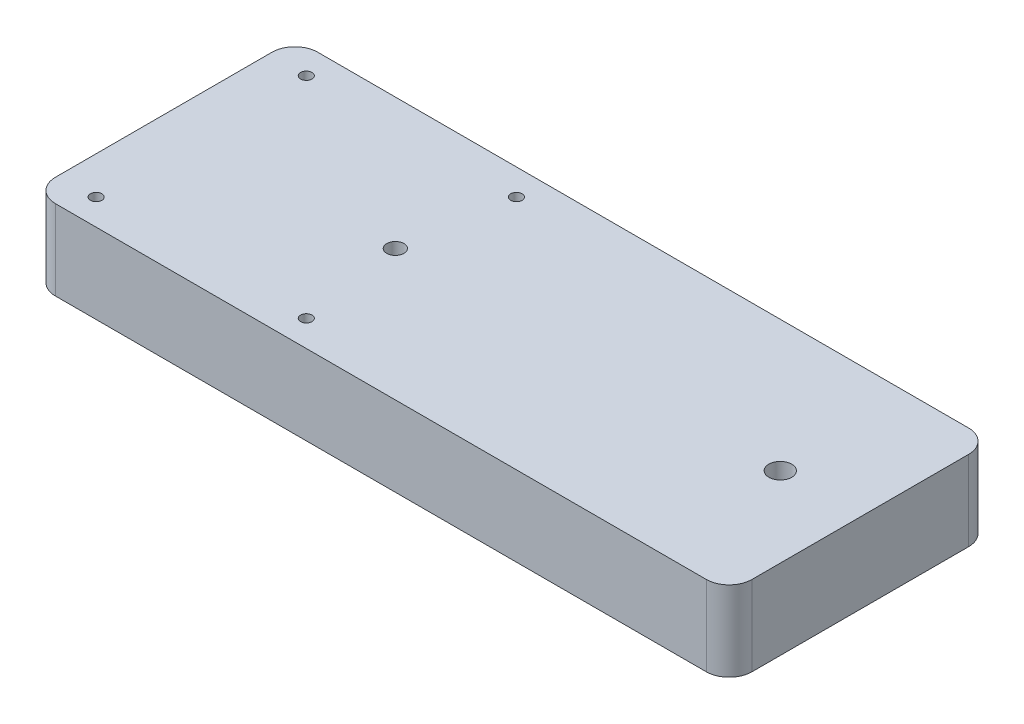
ISO-10303-21;
HEADER;
FILE_DESCRIPTION(('STEP AP214'),'2;1');
FILE_NAME('part.step','',(''),(''),'','','');
FILE_SCHEMA(('AUTOMOTIVE_DESIGN { 1 0 10303 214 1 1 1 1 }'));
ENDSEC;
DATA;
#1=APPLICATION_CONTEXT('core data for automotive mechanical design processes');
#2=APPLICATION_PROTOCOL_DEFINITION('international standard','automotive_design',2000,#1);
#3=PRODUCT_CONTEXT('',#1,'mechanical');
#4=PRODUCT('Part','Part','',(#3));
#5=PRODUCT_RELATED_PRODUCT_CATEGORY('part','',(#4));
#6=PRODUCT_DEFINITION_FORMATION('','',#4);
#7=PRODUCT_DEFINITION_CONTEXT('part definition',#1,'design');
#8=PRODUCT_DEFINITION('design','',#6,#7);
#9=PRODUCT_DEFINITION_SHAPE('','',#8);
#10=(LENGTH_UNIT() NAMED_UNIT(*) SI_UNIT(.MILLI.,.METRE.));
#11=(NAMED_UNIT(*) PLANE_ANGLE_UNIT() SI_UNIT($,.RADIAN.));
#12=(NAMED_UNIT(*) SI_UNIT($,.STERADIAN.) SOLID_ANGLE_UNIT());
#13=UNCERTAINTY_MEASURE_WITH_UNIT(LENGTH_MEASURE(1.E-05),#10,'distance_accuracy_value','');
#14=(GEOMETRIC_REPRESENTATION_CONTEXT(3) GLOBAL_UNCERTAINTY_ASSIGNED_CONTEXT((#13)) GLOBAL_UNIT_ASSIGNED_CONTEXT((#10,
#11,#12)) REPRESENTATION_CONTEXT('',''));
#15=CARTESIAN_POINT('',(0.,0.,0.));
#16=DIRECTION('',(0.,0.,1.));
#17=DIRECTION('',(1.,0.,0.));
#18=AXIS2_PLACEMENT_3D('',#15,#16,#17);
#19=CARTESIAN_POINT('',(232.381351684201,35.,47.3813516842006));
#20=DIRECTION('',(0.,-1.,0.));
#21=DIRECTION('',(0.,0.,-1.));
#22=AXIS2_PLACEMENT_3D('',#19,#20,#21);
#23=CYLINDRICAL_SURFACE('',#22,10.);
#24=CARTESIAN_POINT('',(232.381351684201,0.,47.3813516842006));
#25=DIRECTION('',(0.,1.,0.));
#26=DIRECTION('',(0.,0.,1.));
#27=AXIS2_PLACEMENT_3D('',#24,#25,#26);
#28=CIRCLE('',#27,10.);
#29=CARTESIAN_POINT('',(232.381351684201,0.,57.3813516842006));
#30=VERTEX_POINT('',#29);
#31=CARTESIAN_POINT('',(242.381351684201,0.,47.3813516842006));
#32=VERTEX_POINT('',#31);
#33=EDGE_CURVE('E134',#30,#32,#28,.T.);
#34=ORIENTED_EDGE('',*,*,#33,.T.);
#35=DIRECTION('',(0.,-1.,0.));
#36=VECTOR('',#35,1.);
#37=CARTESIAN_POINT('',(242.381351684201,35.,47.3813516842006));
#38=LINE('',#37,#36);
#39=CARTESIAN_POINT('',(242.381351684201,35.,47.3813516842006));
#40=VERTEX_POINT('',#39);
#41=EDGE_CURVE('E42',#40,#32,#38,.T.);
#42=ORIENTED_EDGE('',*,*,#41,.F.);
#43=CARTESIAN_POINT('',(232.381351684201,35.,47.3813516842006));
#44=DIRECTION('',(0.,1.,0.));
#45=DIRECTION('',(0.,0.,1.));
#46=AXIS2_PLACEMENT_3D('',#43,#44,#45);
#47=CIRCLE('',#46,10.);
#48=CARTESIAN_POINT('',(232.381351684201,35.,57.3813516842006));
#49=VERTEX_POINT('',#48);
#50=EDGE_CURVE('E94',#49,#40,#47,.T.);
#51=ORIENTED_EDGE('',*,*,#50,.F.);
#52=DIRECTION('',(0.,-1.,0.));
#53=VECTOR('',#52,1.);
#54=CARTESIAN_POINT('',(232.381351684201,35.,57.3813516842006));
#55=LINE('',#54,#53);
#56=EDGE_CURVE('E11',#49,#30,#55,.T.);
#57=ORIENTED_EDGE('',*,*,#56,.T.);
#58=EDGE_LOOP('',(#34,#42,#51,#57));
#59=FACE_BOUND('',#58,.T.);
#60=ADVANCED_FACE('F34',(#59),#23,.T.);
#61=CARTESIAN_POINT('',(242.381351684201,35.,-47.3813516842006));
#62=DIRECTION('',(-1.,0.,0.));
#63=DIRECTION('',(0.,0.,1.));
#64=AXIS2_PLACEMENT_3D('',#61,#62,#63);
#65=PLANE('',#64);
#66=DIRECTION('',(0.,0.,-1.));
#67=VECTOR('',#66,1.);
#68=CARTESIAN_POINT('',(242.381351684201,0.,-47.3813516842006));
#69=LINE('',#68,#67);
#70=CARTESIAN_POINT('',(242.381351684201,0.,-47.3813516842006));
#71=VERTEX_POINT('',#70);
#72=EDGE_CURVE('E136',#32,#71,#69,.T.);
#73=ORIENTED_EDGE('',*,*,#72,.T.);
#74=DIRECTION('',(0.,-1.,0.));
#75=VECTOR('',#74,1.);
#76=CARTESIAN_POINT('',(242.381351684201,35.,-47.3813516842006));
#77=LINE('',#76,#75);
#78=CARTESIAN_POINT('',(242.381351684201,35.,-47.3813516842006));
#79=VERTEX_POINT('',#78);
#80=EDGE_CURVE('E155',#79,#71,#77,.T.);
#81=ORIENTED_EDGE('',*,*,#80,.F.);
#82=DIRECTION('',(0.,0.,-1.));
#83=VECTOR('',#82,1.);
#84=CARTESIAN_POINT('',(242.381351684201,35.,-47.3813516842006));
#85=LINE('',#84,#83);
#86=EDGE_CURVE('E163',#40,#79,#85,.T.);
#87=ORIENTED_EDGE('',*,*,#86,.F.);
#88=ORIENTED_EDGE('',*,*,#41,.T.);
#89=EDGE_LOOP('',(#73,#81,#87,#88));
#90=FACE_BOUND('',#89,.T.);
#91=ADVANCED_FACE('F161',(#90),#65,.F.);
#92=CARTESIAN_POINT('',(232.381351684201,35.,-47.3813516842006));
#93=DIRECTION('',(0.,-1.,0.));
#94=DIRECTION('',(0.,0.,-1.));
#95=AXIS2_PLACEMENT_3D('',#92,#93,#94);
#96=CYLINDRICAL_SURFACE('',#95,10.);
#97=CARTESIAN_POINT('',(232.381351684201,0.,-47.3813516842006));
#98=DIRECTION('',(0.,1.,0.));
#99=DIRECTION('',(0.,0.,-1.));
#100=AXIS2_PLACEMENT_3D('',#97,#98,#99);
#101=CIRCLE('',#100,10.);
#102=CARTESIAN_POINT('',(232.381351684201,0.,-57.3813516842006));
#103=VERTEX_POINT('',#102);
#104=EDGE_CURVE('E139',#71,#103,#101,.T.);
#105=ORIENTED_EDGE('',*,*,#104,.T.);
#106=DIRECTION('',(0.,-1.,0.));
#107=VECTOR('',#106,1.);
#108=CARTESIAN_POINT('',(232.381351684201,35.,-57.3813516842006));
#109=LINE('',#108,#107);
#110=CARTESIAN_POINT('',(232.381351684201,35.,-57.3813516842006));
#111=VERTEX_POINT('',#110);
#112=EDGE_CURVE('E152',#111,#103,#109,.T.);
#113=ORIENTED_EDGE('',*,*,#112,.F.);
#114=CARTESIAN_POINT('',(232.381351684201,35.,-47.3813516842006));
#115=DIRECTION('',(0.,1.,0.));
#116=DIRECTION('',(0.,0.,-1.));
#117=AXIS2_PLACEMENT_3D('',#114,#115,#116);
#118=CIRCLE('',#117,10.);
#119=EDGE_CURVE('E175',#79,#111,#118,.T.);
#120=ORIENTED_EDGE('',*,*,#119,.F.);
#121=ORIENTED_EDGE('',*,*,#80,.T.);
#122=EDGE_LOOP('',(#105,#113,#120,#121));
#123=FACE_BOUND('',#122,.T.);
#124=ADVANCED_FACE('F171',(#123),#96,.T.);
#125=CARTESIAN_POINT('',(-52.3813516842006,35.,-57.3813516842006));
#126=DIRECTION('',(0.,0.,1.));
#127=DIRECTION('',(1.,0.,0.));
#128=AXIS2_PLACEMENT_3D('',#125,#126,#127);
#129=PLANE('',#128);
#130=DIRECTION('',(-1.,0.,0.));
#131=VECTOR('',#130,1.);
#132=CARTESIAN_POINT('',(-52.3813516842006,0.,-57.3813516842006));
#133=LINE('',#132,#131);
#134=CARTESIAN_POINT('',(-52.3813516842006,0.,-57.3813516842006));
#135=VERTEX_POINT('',#134);
#136=EDGE_CURVE('E142',#103,#135,#133,.T.);
#137=ORIENTED_EDGE('',*,*,#136,.T.);
#138=DIRECTION('',(0.,-1.,0.));
#139=VECTOR('',#138,1.);
#140=CARTESIAN_POINT('',(-52.3813516842006,35.,-57.3813516842006));
#141=LINE('',#140,#139);
#142=CARTESIAN_POINT('',(-52.3813516842006,35.,-57.3813516842006));
#143=VERTEX_POINT('',#142);
#144=EDGE_CURVE('E123',#143,#135,#141,.T.);
#145=ORIENTED_EDGE('',*,*,#144,.F.);
#146=DIRECTION('',(-1.,0.,0.));
#147=VECTOR('',#146,1.);
#148=CARTESIAN_POINT('',(62.3813516842006,35.,-57.3813516842006));
#149=LINE('',#148,#147);
#150=EDGE_CURVE('E114',#111,#143,#149,.T.);
#151=ORIENTED_EDGE('',*,*,#150,.F.);
#152=ORIENTED_EDGE('',*,*,#112,.T.);
#153=EDGE_LOOP('',(#137,#145,#151,#152));
#154=FACE_BOUND('',#153,.T.);
#155=ADVANCED_FACE('F174',(#154),#129,.F.);
#156=CARTESIAN_POINT('',(-52.3813516842006,35.,-47.3813516842006));
#157=DIRECTION('',(0.,-1.,0.));
#158=DIRECTION('',(0.,0.,-1.));
#159=AXIS2_PLACEMENT_3D('',#156,#157,#158);
#160=CYLINDRICAL_SURFACE('',#159,10.);
#161=CARTESIAN_POINT('',(-52.3813516842006,0.,-47.3813516842006));
#162=DIRECTION('',(0.,1.,0.));
#163=DIRECTION('',(0.,0.,1.));
#164=AXIS2_PLACEMENT_3D('',#161,#162,#163);
#165=CIRCLE('',#164,10.);
#166=CARTESIAN_POINT('',(-62.3813516842006,0.,-47.3813516842006));
#167=VERTEX_POINT('',#166);
#168=EDGE_CURVE('E122',#135,#167,#165,.T.);
#169=ORIENTED_EDGE('',*,*,#168,.T.);
#170=DIRECTION('',(0.,-1.,0.));
#171=VECTOR('',#170,1.);
#172=CARTESIAN_POINT('',(-62.3813516842006,35.,-47.3813516842006));
#173=LINE('',#172,#171);
#174=CARTESIAN_POINT('',(-62.3813516842006,35.,-47.3813516842006));
#175=VERTEX_POINT('',#174);
#176=EDGE_CURVE('E119',#175,#167,#173,.T.);
#177=ORIENTED_EDGE('',*,*,#176,.F.);
#178=CARTESIAN_POINT('',(-52.3813516842006,35.,-47.3813516842006));
#179=DIRECTION('',(0.,1.,0.));
#180=DIRECTION('',(0.,0.,1.));
#181=AXIS2_PLACEMENT_3D('',#178,#179,#180);
#182=CIRCLE('',#181,10.);
#183=EDGE_CURVE('E108',#143,#175,#182,.T.);
#184=ORIENTED_EDGE('',*,*,#183,.F.);
#185=ORIENTED_EDGE('',*,*,#144,.T.);
#186=EDGE_LOOP('',(#169,#177,#184,#185));
#187=FACE_BOUND('',#186,.T.);
#188=ADVANCED_FACE('F120',(#187),#160,.T.);
#189=CARTESIAN_POINT('',(-62.3813516842006,35.,-47.3813516842006));
#190=DIRECTION('',(1.,0.,0.));
#191=DIRECTION('',(0.,0.,-1.));
#192=AXIS2_PLACEMENT_3D('',#189,#190,#191);
#193=PLANE('',#192);
#194=DIRECTION('',(0.,0.,1.));
#195=VECTOR('',#194,1.);
#196=CARTESIAN_POINT('',(-62.3813516842006,0.,-47.3813516842006));
#197=LINE('',#196,#195);
#198=CARTESIAN_POINT('',(-62.3813516842006,0.,47.3813516842006));
#199=VERTEX_POINT('',#198);
#200=EDGE_CURVE('E80',#167,#199,#197,.T.);
#201=ORIENTED_EDGE('',*,*,#200,.T.);
#202=DIRECTION('',(0.,-1.,0.));
#203=VECTOR('',#202,1.);
#204=CARTESIAN_POINT('',(-62.3813516842006,35.,47.3813516842006));
#205=LINE('',#204,#203);
#206=CARTESIAN_POINT('',(-62.3813516842006,35.,47.3813516842006));
#207=VERTEX_POINT('',#206);
#208=EDGE_CURVE('E124',#207,#199,#205,.T.);
#209=ORIENTED_EDGE('',*,*,#208,.F.);
#210=DIRECTION('',(0.,0.,1.));
#211=VECTOR('',#210,1.);
#212=CARTESIAN_POINT('',(-62.3813516842006,35.,-47.3813516842006));
#213=LINE('',#212,#211);
#214=EDGE_CURVE('E112',#175,#207,#213,.T.);
#215=ORIENTED_EDGE('',*,*,#214,.F.);
#216=ORIENTED_EDGE('',*,*,#176,.T.);
#217=EDGE_LOOP('',(#201,#209,#215,#216));
#218=FACE_BOUND('',#217,.T.);
#219=ADVANCED_FACE('F126',(#218),#193,.F.);
#220=CARTESIAN_POINT('',(-52.3813516842006,35.,47.3813516842006));
#221=DIRECTION('',(0.,-1.,0.));
#222=DIRECTION('',(0.,0.,-1.));
#223=AXIS2_PLACEMENT_3D('',#220,#221,#222);
#224=CYLINDRICAL_SURFACE('',#223,9.99999999999999);
#225=CARTESIAN_POINT('',(-52.3813516842006,0.,47.3813516842006));
#226=DIRECTION('',(0.,1.,0.));
#227=DIRECTION('',(0.,0.,1.));
#228=AXIS2_PLACEMENT_3D('',#225,#226,#227);
#229=CIRCLE('',#228,9.99999999999999);
#230=CARTESIAN_POINT('',(-52.3813516842006,0.,57.3813516842006));
#231=VERTEX_POINT('',#230);
#232=EDGE_CURVE('E87',#199,#231,#229,.T.);
#233=ORIENTED_EDGE('',*,*,#232,.T.);
#234=DIRECTION('',(0.,-1.,0.));
#235=VECTOR('',#234,1.);
#236=CARTESIAN_POINT('',(-52.3813516842006,35.,57.3813516842006));
#237=LINE('',#236,#235);
#238=CARTESIAN_POINT('',(-52.3813516842006,35.,57.3813516842006));
#239=VERTEX_POINT('',#238);
#240=EDGE_CURVE('E130',#239,#231,#237,.T.);
#241=ORIENTED_EDGE('',*,*,#240,.F.);
#242=CARTESIAN_POINT('',(-52.3813516842006,35.,47.3813516842006));
#243=DIRECTION('',(0.,1.,0.));
#244=DIRECTION('',(0.,0.,1.));
#245=AXIS2_PLACEMENT_3D('',#242,#243,#244);
#246=CIRCLE('',#245,9.99999999999999);
#247=EDGE_CURVE('E128',#207,#239,#246,.T.);
#248=ORIENTED_EDGE('',*,*,#247,.F.);
#249=ORIENTED_EDGE('',*,*,#208,.T.);
#250=EDGE_LOOP('',(#233,#241,#248,#249));
#251=FACE_BOUND('',#250,.T.);
#252=ADVANCED_FACE('F252',(#251),#224,.T.);
#253=CARTESIAN_POINT('',(-52.3813516842006,35.,57.3813516842006));
#254=DIRECTION('',(0.,0.,-1.));
#255=DIRECTION('',(-1.,0.,0.));
#256=AXIS2_PLACEMENT_3D('',#253,#254,#255);
#257=PLANE('',#256);
#258=DIRECTION('',(1.,0.,0.));
#259=VECTOR('',#258,1.);
#260=CARTESIAN_POINT('',(-52.3813516842006,0.,57.3813516842006));
#261=LINE('',#260,#259);
#262=EDGE_CURVE('E147',#231,#30,#261,.T.);
#263=ORIENTED_EDGE('',*,*,#262,.T.);
#264=ORIENTED_EDGE('',*,*,#56,.F.);
#265=DIRECTION('',(1.,0.,0.));
#266=VECTOR('',#265,1.);
#267=CARTESIAN_POINT('',(62.3813516842006,35.,57.3813516842006));
#268=LINE('',#267,#266);
#269=EDGE_CURVE('E50',#239,#49,#268,.T.);
#270=ORIENTED_EDGE('',*,*,#269,.F.);
#271=ORIENTED_EDGE('',*,*,#240,.T.);
#272=EDGE_LOOP('',(#263,#264,#270,#271));
#273=FACE_BOUND('',#272,.T.);
#274=ADVANCED_FACE('F229',(#273),#257,.F.);
#275=CARTESIAN_POINT('',(232.381351684201,35.,47.3813516842006));
#276=DIRECTION('',(0.,1.,0.));
#277=DIRECTION('',(0.,0.,1.));
#278=AXIS2_PLACEMENT_3D('',#275,#276,#277);
#279=PLANE('',#278);
#280=CARTESIAN_POINT('',(-45.9619407771253,35.,-45.9619407771256));
#281=DIRECTION('',(0.,1.,0.));
#282=DIRECTION('',(0.,0.,1.));
#283=AXIS2_PLACEMENT_3D('',#280,#281,#282);
#284=CIRCLE('',#283,2.5);
#285=CARTESIAN_POINT('',(-45.9619407771253,35.,-43.4619407771256));
#286=VERTEX_POINT('',#285);
#287=EDGE_CURVE('E193',#286,#286,#284,.T.);
#288=ORIENTED_EDGE('',*,*,#287,.F.);
#289=EDGE_LOOP('',(#288));
#290=FACE_BOUND('',#289,.T.);
#291=CARTESIAN_POINT('',(-45.9619407771252,35.,45.9619407771253));
#292=DIRECTION('',(0.,1.,0.));
#293=DIRECTION('',(0.,0.,1.));
#294=AXIS2_PLACEMENT_3D('',#291,#292,#293);
#295=CIRCLE('',#294,2.5);
#296=CARTESIAN_POINT('',(-45.9619407771252,35.,48.4619407771253));
#297=VERTEX_POINT('',#296);
#298=EDGE_CURVE('E199',#297,#297,#295,.T.);
#299=ORIENTED_EDGE('',*,*,#298,.F.);
#300=EDGE_LOOP('',(#299));
#301=FACE_BOUND('',#300,.T.);
#302=CARTESIAN_POINT('',(45.9619407771256,35.,45.9619407771253));
#303=DIRECTION('',(0.,1.,0.));
#304=DIRECTION('',(0.,0.,1.));
#305=AXIS2_PLACEMENT_3D('',#302,#303,#304);
#306=CIRCLE('',#305,2.5);
#307=CARTESIAN_POINT('',(45.9619407771256,35.,48.4619407771253));
#308=VERTEX_POINT('',#307);
#309=EDGE_CURVE('E205',#308,#308,#306,.T.);
#310=ORIENTED_EDGE('',*,*,#309,.F.);
#311=EDGE_LOOP('',(#310));
#312=FACE_BOUND('',#311,.T.);
#313=CARTESIAN_POINT('',(38.9619407771256,35.,0.));
#314=DIRECTION('',(0.,1.,0.));
#315=DIRECTION('',(0.,0.,1.));
#316=AXIS2_PLACEMENT_3D('',#313,#314,#315);
#317=CIRCLE('',#316,3.75000000000001);
#318=CARTESIAN_POINT('',(38.9619407771256,35.,3.75000000000001));
#319=VERTEX_POINT('',#318);
#320=EDGE_CURVE('E211',#319,#319,#317,.T.);
#321=ORIENTED_EDGE('',*,*,#320,.F.);
#322=EDGE_LOOP('',(#321));
#323=FACE_BOUND('',#322,.T.);
#324=CARTESIAN_POINT('',(45.9619407771256,35.,-45.9619407771256));
#325=DIRECTION('',(0.,1.,0.));
#326=DIRECTION('',(0.,0.,1.));
#327=AXIS2_PLACEMENT_3D('',#324,#325,#326);
#328=CIRCLE('',#327,2.5);
#329=CARTESIAN_POINT('',(45.9619407771256,35.,-43.4619407771256));
#330=VERTEX_POINT('',#329);
#331=EDGE_CURVE('E187',#330,#330,#328,.T.);
#332=ORIENTED_EDGE('',*,*,#331,.F.);
#333=EDGE_LOOP('',(#332));
#334=FACE_BOUND('',#333,.T.);
#335=CARTESIAN_POINT('',(207.381351684201,35.,0.));
#336=DIRECTION('',(0.,1.,0.));
#337=DIRECTION('',(0.,0.,1.));
#338=AXIS2_PLACEMENT_3D('',#335,#336,#337);
#339=CIRCLE('',#338,4.99999999999999);
#340=CARTESIAN_POINT('',(207.381351684201,35.,4.99999999999999));
#341=VERTEX_POINT('',#340);
#342=EDGE_CURVE('E183',#341,#341,#339,.T.);
#343=ORIENTED_EDGE('',*,*,#342,.F.);
#344=EDGE_LOOP('',(#343));
#345=FACE_BOUND('',#344,.T.);
#346=ORIENTED_EDGE('',*,*,#269,.T.);
#347=ORIENTED_EDGE('',*,*,#50,.T.);
#348=ORIENTED_EDGE('',*,*,#86,.T.);
#349=ORIENTED_EDGE('',*,*,#119,.T.);
#350=ORIENTED_EDGE('',*,*,#150,.T.);
#351=ORIENTED_EDGE('',*,*,#183,.T.);
#352=ORIENTED_EDGE('',*,*,#214,.T.);
#353=ORIENTED_EDGE('',*,*,#247,.T.);
#354=EDGE_LOOP('',(#346,#347,#348,#349,#350,#351,#352,#353));
#355=FACE_BOUND('',#354,.T.);
#356=ADVANCED_FACE('F110',(#290,#301,#312,#323,#334,#345,#355),#279,.T.);
#357=CARTESIAN_POINT('',(232.381351684201,0.,47.3813516842006));
#358=DIRECTION('',(0.,1.,0.));
#359=DIRECTION('',(0.,0.,1.));
#360=AXIS2_PLACEMENT_3D('',#357,#358,#359);
#361=PLANE('',#360);
#362=CARTESIAN_POINT('',(-45.9619407771253,0.,-45.9619407771256));
#363=DIRECTION('',(0.,1.,0.));
#364=DIRECTION('',(0.,0.,1.));
#365=AXIS2_PLACEMENT_3D('',#362,#363,#364);
#366=CIRCLE('',#365,2.5);
#367=CARTESIAN_POINT('',(-45.9619407771253,0.,-43.4619407771256));
#368=VERTEX_POINT('',#367);
#369=EDGE_CURVE('E196',#368,#368,#366,.T.);
#370=ORIENTED_EDGE('',*,*,#369,.T.);
#371=EDGE_LOOP('',(#370));
#372=FACE_BOUND('',#371,.T.);
#373=CARTESIAN_POINT('',(-45.9619407771252,0.,45.9619407771253));
#374=DIRECTION('',(0.,1.,0.));
#375=DIRECTION('',(0.,0.,1.));
#376=AXIS2_PLACEMENT_3D('',#373,#374,#375);
#377=CIRCLE('',#376,2.5);
#378=CARTESIAN_POINT('',(-45.9619407771252,0.,48.4619407771253));
#379=VERTEX_POINT('',#378);
#380=EDGE_CURVE('E202',#379,#379,#377,.T.);
#381=ORIENTED_EDGE('',*,*,#380,.T.);
#382=EDGE_LOOP('',(#381));
#383=FACE_BOUND('',#382,.T.);
#384=CARTESIAN_POINT('',(45.9619407771256,0.,45.9619407771253));
#385=DIRECTION('',(0.,1.,0.));
#386=DIRECTION('',(0.,0.,1.));
#387=AXIS2_PLACEMENT_3D('',#384,#385,#386);
#388=CIRCLE('',#387,2.5);
#389=CARTESIAN_POINT('',(45.9619407771256,0.,48.4619407771253));
#390=VERTEX_POINT('',#389);
#391=EDGE_CURVE('E208',#390,#390,#388,.T.);
#392=ORIENTED_EDGE('',*,*,#391,.T.);
#393=EDGE_LOOP('',(#392));
#394=FACE_BOUND('',#393,.T.);
#395=CARTESIAN_POINT('',(38.9619407771256,0.,0.));
#396=DIRECTION('',(0.,1.,0.));
#397=DIRECTION('',(0.,0.,1.));
#398=AXIS2_PLACEMENT_3D('',#395,#396,#397);
#399=CIRCLE('',#398,3.75000000000001);
#400=CARTESIAN_POINT('',(38.9619407771256,0.,3.75000000000001));
#401=VERTEX_POINT('',#400);
#402=EDGE_CURVE('E190',#401,#401,#399,.T.);
#403=ORIENTED_EDGE('',*,*,#402,.T.);
#404=EDGE_LOOP('',(#403));
#405=FACE_BOUND('',#404,.T.);
#406=CARTESIAN_POINT('',(45.9619407771256,0.,-45.9619407771256));
#407=DIRECTION('',(0.,1.,0.));
#408=DIRECTION('',(0.,0.,1.));
#409=AXIS2_PLACEMENT_3D('',#406,#407,#408);
#410=CIRCLE('',#409,2.5);
#411=CARTESIAN_POINT('',(45.9619407771256,0.,-43.4619407771256));
#412=VERTEX_POINT('',#411);
#413=EDGE_CURVE('E186',#412,#412,#410,.T.);
#414=ORIENTED_EDGE('',*,*,#413,.T.);
#415=EDGE_LOOP('',(#414));
#416=FACE_BOUND('',#415,.T.);
#417=CARTESIAN_POINT('',(207.381351684201,0.,0.));
#418=DIRECTION('',(0.,1.,0.));
#419=DIRECTION('',(0.,0.,1.));
#420=AXIS2_PLACEMENT_3D('',#417,#418,#419);
#421=CIRCLE('',#420,4.99999999999999);
#422=CARTESIAN_POINT('',(207.381351684201,0.,4.99999999999999));
#423=VERTEX_POINT('',#422);
#424=EDGE_CURVE('E137',#423,#423,#421,.F.);
#425=ORIENTED_EDGE('',*,*,#424,.F.);
#426=EDGE_LOOP('',(#425));
#427=FACE_BOUND('',#426,.T.);
#428=ORIENTED_EDGE('',*,*,#33,.F.);
#429=ORIENTED_EDGE('',*,*,#262,.F.);
#430=ORIENTED_EDGE('',*,*,#232,.F.);
#431=ORIENTED_EDGE('',*,*,#200,.F.);
#432=ORIENTED_EDGE('',*,*,#168,.F.);
#433=ORIENTED_EDGE('',*,*,#136,.F.);
#434=ORIENTED_EDGE('',*,*,#104,.F.);
#435=ORIENTED_EDGE('',*,*,#72,.F.);
#436=EDGE_LOOP('',(#428,#429,#430,#431,#432,#433,#434,#435));
#437=FACE_BOUND('',#436,.T.);
#438=ADVANCED_FACE('F167',(#372,#383,#394,#405,#416,#427,#437),#361,.F.);
#439=CARTESIAN_POINT('',(207.381351684201,-14.1421356237309,0.));
#440=DIRECTION('',(0.,1.,0.));
#441=DIRECTION('',(0.,0.,1.));
#442=AXIS2_PLACEMENT_3D('',#439,#440,#441);
#443=CYLINDRICAL_SURFACE('',#442,4.99999999999999);
#444=ORIENTED_EDGE('',*,*,#424,.T.);
#445=EDGE_LOOP('',(#444));
#446=FACE_BOUND('',#445,.T.);
#447=ORIENTED_EDGE('',*,*,#342,.T.);
#448=EDGE_LOOP('',(#447));
#449=FACE_BOUND('',#448,.T.);
#450=ADVANCED_FACE('F236',(#446,#449),#443,.F.);
#451=CARTESIAN_POINT('',(45.9619407771256,0.,-45.9619407771256));
#452=DIRECTION('',(0.,1.,0.));
#453=DIRECTION('',(0.,0.,1.));
#454=AXIS2_PLACEMENT_3D('',#451,#452,#453);
#455=CYLINDRICAL_SURFACE('',#454,2.5);
#456=ORIENTED_EDGE('',*,*,#413,.F.);
#457=EDGE_LOOP('',(#456));
#458=FACE_BOUND('',#457,.T.);
#459=ORIENTED_EDGE('',*,*,#331,.T.);
#460=EDGE_LOOP('',(#459));
#461=FACE_BOUND('',#460,.T.);
#462=ADVANCED_FACE('F223',(#458,#461),#455,.F.);
#463=CARTESIAN_POINT('',(38.9619407771256,0.,0.));
#464=DIRECTION('',(0.,1.,0.));
#465=DIRECTION('',(0.,0.,1.));
#466=AXIS2_PLACEMENT_3D('',#463,#464,#465);
#467=CYLINDRICAL_SURFACE('',#466,3.75000000000001);
#468=ORIENTED_EDGE('',*,*,#402,.F.);
#469=EDGE_LOOP('',(#468));
#470=FACE_BOUND('',#469,.T.);
#471=ORIENTED_EDGE('',*,*,#320,.T.);
#472=EDGE_LOOP('',(#471));
#473=FACE_BOUND('',#472,.T.);
#474=ADVANCED_FACE('F219',(#470,#473),#467,.F.);
#475=CARTESIAN_POINT('',(45.9619407771256,0.,45.9619407771253));
#476=DIRECTION('',(0.,1.,0.));
#477=DIRECTION('',(0.,0.,1.));
#478=AXIS2_PLACEMENT_3D('',#475,#476,#477);
#479=CYLINDRICAL_SURFACE('',#478,2.5);
#480=ORIENTED_EDGE('',*,*,#391,.F.);
#481=EDGE_LOOP('',(#480));
#482=FACE_BOUND('',#481,.T.);
#483=ORIENTED_EDGE('',*,*,#309,.T.);
#484=EDGE_LOOP('',(#483));
#485=FACE_BOUND('',#484,.T.);
#486=ADVANCED_FACE('F222',(#482,#485),#479,.F.);
#487=CARTESIAN_POINT('',(-45.9619407771252,0.,45.9619407771253));
#488=DIRECTION('',(0.,1.,0.));
#489=DIRECTION('',(0.,0.,1.));
#490=AXIS2_PLACEMENT_3D('',#487,#488,#489);
#491=CYLINDRICAL_SURFACE('',#490,2.5);
#492=ORIENTED_EDGE('',*,*,#380,.F.);
#493=EDGE_LOOP('',(#492));
#494=FACE_BOUND('',#493,.T.);
#495=ORIENTED_EDGE('',*,*,#298,.T.);
#496=EDGE_LOOP('',(#495));
#497=FACE_BOUND('',#496,.T.);
#498=ADVANCED_FACE('F331',(#494,#497),#491,.F.);
#499=CARTESIAN_POINT('',(-45.9619407771253,0.,-45.9619407771256));
#500=DIRECTION('',(0.,1.,0.));
#501=DIRECTION('',(0.,0.,1.));
#502=AXIS2_PLACEMENT_3D('',#499,#500,#501);
#503=CYLINDRICAL_SURFACE('',#502,2.5);
#504=ORIENTED_EDGE('',*,*,#369,.F.);
#505=EDGE_LOOP('',(#504));
#506=FACE_BOUND('',#505,.T.);
#507=ORIENTED_EDGE('',*,*,#287,.T.);
#508=EDGE_LOOP('',(#507));
#509=FACE_BOUND('',#508,.T.);
#510=ADVANCED_FACE('F341',(#506,#509),#503,.F.);
#511=CLOSED_SHELL('',(#60,#91,#124,#155,#188,#219,#252,#274,#356,#438,#450,#462,#474,#486,#498,#510));
#512=MANIFOLD_SOLID_BREP('B2',#511);
#513=ADVANCED_BREP_SHAPE_REPRESENTATION('',(#18,#512),#14);
#514=SHAPE_DEFINITION_REPRESENTATION(#9,#513);
ENDSEC;
END-ISO-10303-21;
